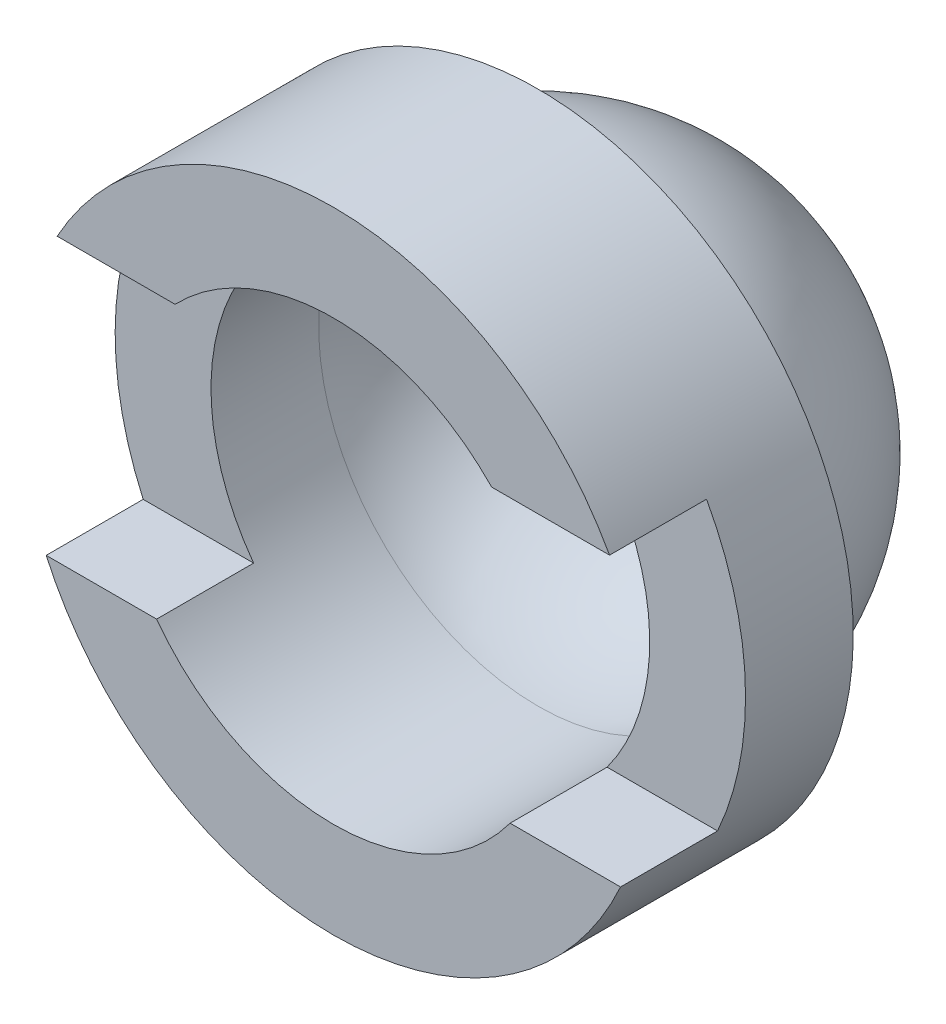
ISO-10303-21;
HEADER;
FILE_DESCRIPTION(('STEP AP214'),'2;1');
FILE_NAME('part.step','',(''),(''),'','','');
FILE_SCHEMA(('AUTOMOTIVE_DESIGN { 1 0 10303 214 1 1 1 1 }'));
ENDSEC;
DATA;
#1=APPLICATION_CONTEXT('core data for automotive mechanical design processes');
#2=APPLICATION_PROTOCOL_DEFINITION('international standard','automotive_design',2000,#1);
#3=PRODUCT_CONTEXT('',#1,'mechanical');
#4=PRODUCT('Part','Part','',(#3));
#5=PRODUCT_RELATED_PRODUCT_CATEGORY('part','',(#4));
#6=PRODUCT_DEFINITION_FORMATION('','',#4);
#7=PRODUCT_DEFINITION_CONTEXT('part definition',#1,'design');
#8=PRODUCT_DEFINITION('design','',#6,#7);
#9=PRODUCT_DEFINITION_SHAPE('','',#8);
#10=(LENGTH_UNIT() NAMED_UNIT(*) SI_UNIT(.MILLI.,.METRE.));
#11=(NAMED_UNIT(*) PLANE_ANGLE_UNIT() SI_UNIT($,.RADIAN.));
#12=(NAMED_UNIT(*) SI_UNIT($,.STERADIAN.) SOLID_ANGLE_UNIT());
#13=UNCERTAINTY_MEASURE_WITH_UNIT(LENGTH_MEASURE(1.E-05),#10,'distance_accuracy_value','');
#14=(GEOMETRIC_REPRESENTATION_CONTEXT(3) GLOBAL_UNCERTAINTY_ASSIGNED_CONTEXT((#13)) GLOBAL_UNIT_ASSIGNED_CONTEXT((#10,
#11,#12)) REPRESENTATION_CONTEXT('',''));
#15=CARTESIAN_POINT('',(0.,0.,0.));
#16=DIRECTION('',(0.,0.,1.));
#17=DIRECTION('',(1.,0.,0.));
#18=AXIS2_PLACEMENT_3D('',#15,#16,#17);
#19=CARTESIAN_POINT('',(0.,6.5,0.));
#20=DIRECTION('',(0.,0.,-1.));
#21=DIRECTION('',(0.,1.,0.));
#22=AXIS2_PLACEMENT_3D('',#19,#20,#21);
#23=PLANE('',#22);
#24=CARTESIAN_POINT('',(0.,0.,0.));
#25=DIRECTION('',(0.,0.,1.));
#26=DIRECTION('',(0.,-1.,0.));
#27=AXIS2_PLACEMENT_3D('',#24,#25,#26);
#28=CIRCLE('',#27,6.5);
#29=CARTESIAN_POINT('',(5.69555945775046,3.13218812704941,0.));
#30=VERTEX_POINT('',#29);
#31=CARTESIAN_POINT('',(-5.69555945775046,3.13218812704941,0.));
#32=VERTEX_POINT('',#31);
#33=EDGE_CURVE('E134',#30,#32,#28,.T.);
#34=ORIENTED_EDGE('',*,*,#33,.T.);
#35=DIRECTION('',(-1.,0.,0.));
#36=VECTOR('',#35,1.);
#37=CARTESIAN_POINT('',(-7.9348765885251,3.13218812704941,0.));
#38=LINE('',#37,#36);
#39=CARTESIAN_POINT('',(-3.26387819684323,3.13218812704941,0.));
#40=VERTEX_POINT('',#39);
#41=EDGE_CURVE('E125',#40,#32,#38,.T.);
#42=ORIENTED_EDGE('',*,*,#41,.F.);
#43=CARTESIAN_POINT('',(0.,0.,0.));
#44=DIRECTION('',(0.,0.,1.));
#45=DIRECTION('',(0.,-1.,0.));
#46=AXIS2_PLACEMENT_3D('',#43,#44,#45);
#47=CIRCLE('',#46,4.52366039254251);
#48=CARTESIAN_POINT('',(3.26387819684323,3.13218812704941,0.));
#49=VERTEX_POINT('',#48);
#50=EDGE_CURVE('E147',#49,#40,#47,.T.);
#51=ORIENTED_EDGE('',*,*,#50,.F.);
#52=EDGE_CURVE('E170',#30,#49,#38,.T.);
#53=ORIENTED_EDGE('',*,*,#52,.F.);
#54=EDGE_LOOP('',(#34,#42,#51,#53));
#55=FACE_BOUND('',#54,.T.);
#56=ADVANCED_FACE('F39',(#55),#23,.F.);
#57=CARTESIAN_POINT('',(0.,0.,-4.22040982590073));
#58=DIRECTION('',(0.,0.,1.));
#59=DIRECTION('',(0.,1.,0.));
#60=AXIS2_PLACEMENT_3D('',#57,#58,#59);
#61=SPHERICAL_SURFACE('',#60,5.27959017409927);
#62=CARTESIAN_POINT('',(0.,0.,-4.22040982590073));
#63=DIRECTION('',(0.,0.,1.));
#64=DIRECTION('',(0.,-1.,0.));
#65=AXIS2_PLACEMENT_3D('',#62,#63,#64);
#66=CIRCLE('',#65,5.27959017409927);
#67=CARTESIAN_POINT('',(0.,-5.27959017409927,-4.22040982590073));
#68=VERTEX_POINT('',#67);
#69=EDGE_CURVE('E141',#68,#68,#66,.T.);
#70=ORIENTED_EDGE('',*,*,#69,.F.);
#71=EDGE_LOOP('',(#70));
#72=FACE_BOUND('',#71,.T.);
#73=ADVANCED_FACE('F41',(#72),#61,.T.);
#74=CARTESIAN_POINT('',(0.,0.,-4.22040982590073));
#75=DIRECTION('',(0.,0.,1.));
#76=DIRECTION('',(0.,1.,0.));
#77=AXIS2_PLACEMENT_3D('',#74,#75,#76);
#78=SPHERICAL_SURFACE('',#77,4.52366039254251);
#79=CARTESIAN_POINT('',(0.,0.,-4.22040982590073));
#80=DIRECTION('',(0.,0.,1.));
#81=DIRECTION('',(0.,-1.,0.));
#82=AXIS2_PLACEMENT_3D('',#79,#80,#81);
#83=CIRCLE('',#82,4.52366039254251);
#84=CARTESIAN_POINT('',(0.,-4.52366039254251,-4.22040982590073));
#85=VERTEX_POINT('',#84);
#86=EDGE_CURVE('E148',#85,#85,#83,.T.);
#87=ORIENTED_EDGE('',*,*,#86,.T.);
#88=EDGE_LOOP('',(#87));
#89=FACE_BOUND('',#88,.T.);
#90=ADVANCED_FACE('F205',(#89),#78,.F.);
#91=CARTESIAN_POINT('',(0.,0.,0.));
#92=DIRECTION('',(0.,0.,1.));
#93=DIRECTION('',(0.,-1.,0.));
#94=AXIS2_PLACEMENT_3D('',#91,#92,#93);
#95=CYLINDRICAL_SURFACE('',#94,4.52366039254251);
#96=ORIENTED_EDGE('',*,*,#50,.T.);
#97=DIRECTION('',(0.,0.,1.));
#98=VECTOR('',#97,1.);
#99=CARTESIAN_POINT('',(-3.26387819684323,3.13218812704941,0.));
#100=LINE('',#99,#98);
#101=CARTESIAN_POINT('',(-3.26387819684323,3.13218812704941,-2.));
#102=VERTEX_POINT('',#101);
#103=EDGE_CURVE('E195',#40,#102,#100,.F.);
#104=ORIENTED_EDGE('',*,*,#103,.T.);
#105=CARTESIAN_POINT('',(0.,0.,-2.));
#106=DIRECTION('',(0.,0.,1.));
#107=DIRECTION('',(1.,0.,0.));
#108=AXIS2_PLACEMENT_3D('',#105,#106,#107);
#109=CIRCLE('',#108,4.52366039254251);
#110=CARTESIAN_POINT('',(-3.64450059419288,-2.67976095314222,-2.));
#111=VERTEX_POINT('',#110);
#112=EDGE_CURVE('E183',#111,#102,#109,.F.);
#113=ORIENTED_EDGE('',*,*,#112,.F.);
#114=DIRECTION('',(0.,0.,1.));
#115=VECTOR('',#114,1.);
#116=CARTESIAN_POINT('',(-3.64450059419288,-2.67976095314222,0.));
#117=LINE('',#116,#115);
#118=CARTESIAN_POINT('',(-3.64450059419288,-2.67976095314222,0.));
#119=VERTEX_POINT('',#118);
#120=EDGE_CURVE('E185',#111,#119,#117,.T.);
#121=ORIENTED_EDGE('',*,*,#120,.T.);
#122=CARTESIAN_POINT('',(3.64450059419288,-2.67976095314222,0.));
#123=VERTEX_POINT('',#122);
#124=EDGE_CURVE('E123',#119,#123,#47,.T.);
#125=ORIENTED_EDGE('',*,*,#124,.T.);
#126=DIRECTION('',(0.,0.,1.));
#127=VECTOR('',#126,1.);
#128=CARTESIAN_POINT('',(3.64450059419288,-2.67976095314222,0.));
#129=LINE('',#128,#127);
#130=CARTESIAN_POINT('',(3.64450059419288,-2.67976095314222,-2.));
#131=VERTEX_POINT('',#130);
#132=EDGE_CURVE('E188',#123,#131,#129,.F.);
#133=ORIENTED_EDGE('',*,*,#132,.T.);
#134=CARTESIAN_POINT('',(3.26387819684323,3.13218812704941,-2.));
#135=VERTEX_POINT('',#134);
#136=EDGE_CURVE('E180',#135,#131,#109,.F.);
#137=ORIENTED_EDGE('',*,*,#136,.F.);
#138=DIRECTION('',(0.,0.,1.));
#139=VECTOR('',#138,1.);
#140=CARTESIAN_POINT('',(3.26387819684323,3.13218812704941,0.));
#141=LINE('',#140,#139);
#142=EDGE_CURVE('E192',#135,#49,#141,.T.);
#143=ORIENTED_EDGE('',*,*,#142,.T.);
#144=EDGE_LOOP('',(#96,#104,#113,#121,#125,#133,#137,#143));
#145=FACE_BOUND('',#144,.T.);
#146=ORIENTED_EDGE('',*,*,#86,.F.);
#147=EDGE_LOOP('',(#146));
#148=FACE_BOUND('',#147,.T.);
#149=ADVANCED_FACE('F210',(#145,#148),#95,.F.);
#150=CARTESIAN_POINT('',(-5.92189844847194,-2.67976095314222,0.));
#151=VERTEX_POINT('',#150);
#152=CARTESIAN_POINT('',(5.92189844847194,-2.67976095314222,0.));
#153=VERTEX_POINT('',#152);
#154=EDGE_CURVE('E121',#151,#153,#28,.T.);
#155=ORIENTED_EDGE('',*,*,#154,.T.);
#156=DIRECTION('',(1.,0.,0.));
#157=VECTOR('',#156,1.);
#158=CARTESIAN_POINT('',(-7.9348765885251,-2.67976095314222,0.));
#159=LINE('',#158,#157);
#160=EDGE_CURVE('E126',#123,#153,#159,.T.);
#161=ORIENTED_EDGE('',*,*,#160,.F.);
#162=ORIENTED_EDGE('',*,*,#124,.F.);
#163=EDGE_CURVE('E107',#151,#119,#159,.T.);
#164=ORIENTED_EDGE('',*,*,#163,.F.);
#165=EDGE_LOOP('',(#155,#161,#162,#164));
#166=FACE_BOUND('',#165,.T.);
#167=ADVANCED_FACE('F119',(#166),#23,.F.);
#168=CARTESIAN_POINT('',(0.,0.,0.));
#169=DIRECTION('',(0.,0.,1.));
#170=DIRECTION('',(0.,-1.,0.));
#171=AXIS2_PLACEMENT_3D('',#168,#169,#170);
#172=CYLINDRICAL_SURFACE('',#171,6.5);
#173=CARTESIAN_POINT('',(0.,0.,-2.));
#174=DIRECTION('',(0.,0.,1.));
#175=DIRECTION('',(1.,0.,0.));
#176=AXIS2_PLACEMENT_3D('',#173,#174,#175);
#177=CIRCLE('',#176,6.5);
#178=CARTESIAN_POINT('',(-5.69555945775046,3.13218812704941,-2.));
#179=VERTEX_POINT('',#178);
#180=CARTESIAN_POINT('',(-5.92189844847194,-2.67976095314222,-2.));
#181=VERTEX_POINT('',#180);
#182=EDGE_CURVE('E115',#179,#181,#177,.T.);
#183=ORIENTED_EDGE('',*,*,#182,.F.);
#184=DIRECTION('',(0.,0.,1.));
#185=VECTOR('',#184,1.);
#186=CARTESIAN_POINT('',(-5.69555945775046,3.13218812704941,0.));
#187=LINE('',#186,#185);
#188=EDGE_CURVE('E11',#179,#32,#187,.T.);
#189=ORIENTED_EDGE('',*,*,#188,.T.);
#190=ORIENTED_EDGE('',*,*,#33,.F.);
#191=DIRECTION('',(0.,0.,1.));
#192=VECTOR('',#191,1.);
#193=CARTESIAN_POINT('',(5.69555945775046,3.13218812704941,0.));
#194=LINE('',#193,#192);
#195=CARTESIAN_POINT('',(5.69555945775046,3.13218812704941,-2.));
#196=VERTEX_POINT('',#195);
#197=EDGE_CURVE('E157',#30,#196,#194,.F.);
#198=ORIENTED_EDGE('',*,*,#197,.T.);
#199=CARTESIAN_POINT('',(5.92189844847194,-2.67976095314222,-2.));
#200=VERTEX_POINT('',#199);
#201=EDGE_CURVE('E152',#200,#196,#177,.T.);
#202=ORIENTED_EDGE('',*,*,#201,.F.);
#203=DIRECTION('',(0.,0.,1.));
#204=VECTOR('',#203,1.);
#205=CARTESIAN_POINT('',(5.92189844847194,-2.67976095314222,0.));
#206=LINE('',#205,#204);
#207=EDGE_CURVE('E132',#200,#153,#206,.T.);
#208=ORIENTED_EDGE('',*,*,#207,.T.);
#209=ORIENTED_EDGE('',*,*,#154,.F.);
#210=DIRECTION('',(0.,0.,1.));
#211=VECTOR('',#210,1.);
#212=CARTESIAN_POINT('',(-5.92189844847194,-2.67976095314222,0.));
#213=LINE('',#212,#211);
#214=EDGE_CURVE('E48',#151,#181,#213,.F.);
#215=ORIENTED_EDGE('',*,*,#214,.T.);
#216=EDGE_LOOP('',(#183,#189,#190,#198,#202,#208,#209,#215));
#217=FACE_BOUND('',#216,.T.);
#218=CARTESIAN_POINT('',(0.,0.,-4.22040982590073));
#219=DIRECTION('',(0.,0.,1.));
#220=DIRECTION('',(0.,-1.,0.));
#221=AXIS2_PLACEMENT_3D('',#218,#219,#220);
#222=CIRCLE('',#221,6.5);
#223=CARTESIAN_POINT('',(0.,-6.5,-4.22040982590073));
#224=VERTEX_POINT('',#223);
#225=EDGE_CURVE('E135',#224,#224,#222,.T.);
#226=ORIENTED_EDGE('',*,*,#225,.T.);
#227=EDGE_LOOP('',(#226));
#228=FACE_BOUND('',#227,.T.);
#229=ADVANCED_FACE('F129',(#217,#228),#172,.T.);
#230=CARTESIAN_POINT('',(0.,5.27959017409927,-4.22040982590073));
#231=DIRECTION('',(0.,0.,1.));
#232=DIRECTION('',(0.,-1.,0.));
#233=AXIS2_PLACEMENT_3D('',#230,#231,#232);
#234=PLANE('',#233);
#235=ORIENTED_EDGE('',*,*,#225,.F.);
#236=EDGE_LOOP('',(#235));
#237=FACE_BOUND('',#236,.T.);
#238=ORIENTED_EDGE('',*,*,#69,.T.);
#239=EDGE_LOOP('',(#238));
#240=FACE_BOUND('',#239,.T.);
#241=ADVANCED_FACE('F202',(#237,#240),#234,.F.);
#242=CARTESIAN_POINT('',(0.,0.,-2.));
#243=DIRECTION('',(0.,0.,1.));
#244=DIRECTION('',(1.,0.,0.));
#245=AXIS2_PLACEMENT_3D('',#242,#243,#244);
#246=PLANE('',#245);
#247=ORIENTED_EDGE('',*,*,#136,.T.);
#248=DIRECTION('',(1.,0.,0.));
#249=VECTOR('',#248,1.);
#250=CARTESIAN_POINT('',(-7.9348765885251,-2.67976095314222,-2.));
#251=LINE('',#250,#249);
#252=EDGE_CURVE('E63',#131,#200,#251,.T.);
#253=ORIENTED_EDGE('',*,*,#252,.T.);
#254=ORIENTED_EDGE('',*,*,#201,.T.);
#255=DIRECTION('',(-1.,0.,0.));
#256=VECTOR('',#255,1.);
#257=CARTESIAN_POINT('',(-7.9348765885251,3.13218812704941,-2.));
#258=LINE('',#257,#256);
#259=EDGE_CURVE('E184',#196,#135,#258,.T.);
#260=ORIENTED_EDGE('',*,*,#259,.T.);
#261=EDGE_LOOP('',(#247,#253,#254,#260));
#262=FACE_BOUND('',#261,.T.);
#263=ADVANCED_FACE('F232',(#262),#246,.T.);
#264=CARTESIAN_POINT('',(-7.9348765885251,-2.67976095314222,-2.));
#265=DIRECTION('',(0.,-1.,0.));
#266=DIRECTION('',(0.,0.,-1.));
#267=AXIS2_PLACEMENT_3D('',#264,#265,#266);
#268=PLANE('',#267);
#269=ORIENTED_EDGE('',*,*,#160,.T.);
#270=ORIENTED_EDGE('',*,*,#207,.F.);
#271=ORIENTED_EDGE('',*,*,#252,.F.);
#272=ORIENTED_EDGE('',*,*,#132,.F.);
#273=EDGE_LOOP('',(#269,#270,#271,#272));
#274=FACE_BOUND('',#273,.T.);
#275=ADVANCED_FACE('F245',(#274),#268,.F.);
#276=CARTESIAN_POINT('',(-7.9348765885251,3.13218812704941,-2.));
#277=DIRECTION('',(0.,1.,0.));
#278=DIRECTION('',(0.,0.,1.));
#279=AXIS2_PLACEMENT_3D('',#276,#277,#278);
#280=PLANE('',#279);
#281=ORIENTED_EDGE('',*,*,#259,.F.);
#282=ORIENTED_EDGE('',*,*,#197,.F.);
#283=ORIENTED_EDGE('',*,*,#52,.T.);
#284=ORIENTED_EDGE('',*,*,#142,.F.);
#285=EDGE_LOOP('',(#281,#282,#283,#284));
#286=FACE_BOUND('',#285,.T.);
#287=ADVANCED_FACE('F231',(#286),#280,.F.);
#288=ORIENTED_EDGE('',*,*,#41,.T.);
#289=ORIENTED_EDGE('',*,*,#188,.F.);
#290=EDGE_CURVE('E55',#102,#179,#258,.T.);
#291=ORIENTED_EDGE('',*,*,#290,.F.);
#292=ORIENTED_EDGE('',*,*,#103,.F.);
#293=EDGE_LOOP('',(#288,#289,#291,#292));
#294=FACE_BOUND('',#293,.T.);
#295=ADVANCED_FACE('F237',(#294),#280,.F.);
#296=EDGE_CURVE('E110',#181,#111,#251,.T.);
#297=ORIENTED_EDGE('',*,*,#296,.F.);
#298=ORIENTED_EDGE('',*,*,#214,.F.);
#299=ORIENTED_EDGE('',*,*,#163,.T.);
#300=ORIENTED_EDGE('',*,*,#120,.F.);
#301=EDGE_LOOP('',(#297,#298,#299,#300));
#302=FACE_BOUND('',#301,.T.);
#303=ADVANCED_FACE('F106',(#302),#268,.F.);
#304=ORIENTED_EDGE('',*,*,#112,.T.);
#305=ORIENTED_EDGE('',*,*,#290,.T.);
#306=ORIENTED_EDGE('',*,*,#182,.T.);
#307=ORIENTED_EDGE('',*,*,#296,.T.);
#308=EDGE_LOOP('',(#304,#305,#306,#307));
#309=FACE_BOUND('',#308,.T.);
#310=ADVANCED_FACE('F162',(#309),#246,.T.);
#311=CLOSED_SHELL('',(#56,#73,#90,#149,#167,#229,#241,#263,#275,#287,#295,#303,#310));
#312=MANIFOLD_SOLID_BREP('B2',#311);
#313=ADVANCED_BREP_SHAPE_REPRESENTATION('',(#18,#312),#14);
#314=SHAPE_DEFINITION_REPRESENTATION(#9,#313);
ENDSEC;
END-ISO-10303-21;
